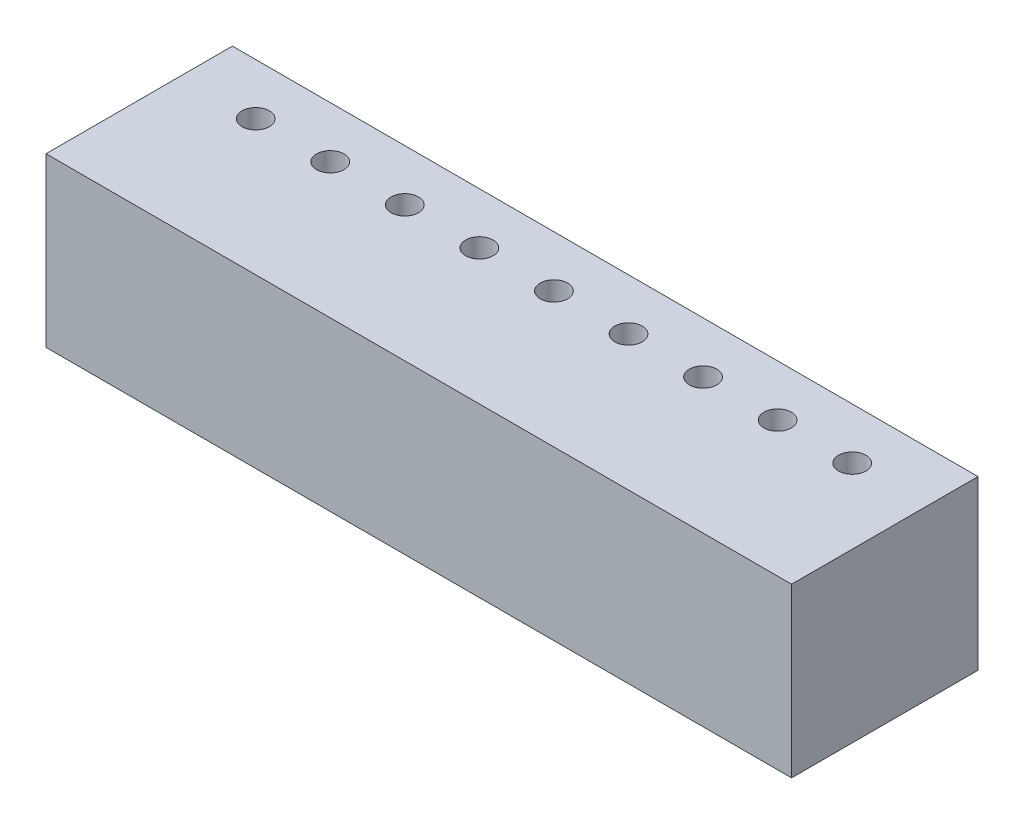
ISO-10303-21;
HEADER;
FILE_DESCRIPTION(('STEP AP214'),'2;1');
FILE_NAME('part.step','',(''),(''),'','','');
FILE_SCHEMA(('AUTOMOTIVE_DESIGN { 1 0 10303 214 1 1 1 1 }'));
ENDSEC;
DATA;
#1=APPLICATION_CONTEXT('core data for automotive mechanical design processes');
#2=APPLICATION_PROTOCOL_DEFINITION('international standard','automotive_design',2000,#1);
#3=PRODUCT_CONTEXT('',#1,'mechanical');
#4=PRODUCT('Part','Part','',(#3));
#5=PRODUCT_RELATED_PRODUCT_CATEGORY('part','',(#4));
#6=PRODUCT_DEFINITION_FORMATION('','',#4);
#7=PRODUCT_DEFINITION_CONTEXT('part definition',#1,'design');
#8=PRODUCT_DEFINITION('design','',#6,#7);
#9=PRODUCT_DEFINITION_SHAPE('','',#8);
#10=(LENGTH_UNIT() NAMED_UNIT(*) SI_UNIT(.MILLI.,.METRE.));
#11=(NAMED_UNIT(*) PLANE_ANGLE_UNIT() SI_UNIT($,.RADIAN.));
#12=(NAMED_UNIT(*) SI_UNIT($,.STERADIAN.) SOLID_ANGLE_UNIT());
#13=UNCERTAINTY_MEASURE_WITH_UNIT(LENGTH_MEASURE(1.E-05),#10,'distance_accuracy_value','');
#14=(GEOMETRIC_REPRESENTATION_CONTEXT(3) GLOBAL_UNCERTAINTY_ASSIGNED_CONTEXT((#13)) GLOBAL_UNIT_ASSIGNED_CONTEXT((#10,
#11,#12)) REPRESENTATION_CONTEXT('',''));
#15=CARTESIAN_POINT('',(0.,0.,0.));
#16=DIRECTION('',(0.,0.,1.));
#17=DIRECTION('',(1.,0.,0.));
#18=AXIS2_PLACEMENT_3D('',#15,#16,#17);
#19=CARTESIAN_POINT('',(0.,9.,0.));
#20=DIRECTION('',(0.,1.,0.));
#21=DIRECTION('',(0.,0.,1.));
#22=AXIS2_PLACEMENT_3D('',#19,#20,#21);
#23=PLANE('',#22);
#24=CARTESIAN_POINT('',(-3.54411764705882,9.,-11.441176470588));
#25=DIRECTION('',(0.,1.,0.));
#26=DIRECTION('',(0.,0.,1.));
#27=AXIS2_PLACEMENT_3D('',#24,#25,#26);
#28=CIRCLE('',#27,0.735294117647059);
#29=CARTESIAN_POINT('',(-3.54411764705882,9.,-10.705882352941));
#30=VERTEX_POINT('',#29);
#31=EDGE_CURVE('E151',#30,#30,#28,.T.);
#32=ORIENTED_EDGE('',*,*,#31,.F.);
#33=EDGE_LOOP('',(#32));
#34=FACE_BOUND('',#33,.T.);
#35=CARTESIAN_POINT('',(4.45588235294118,9.,-11.4411764705881));
#36=DIRECTION('',(0.,1.,0.));
#37=DIRECTION('',(0.,0.,1.));
#38=AXIS2_PLACEMENT_3D('',#35,#36,#37);
#39=CIRCLE('',#38,0.735294117647059);
#40=CARTESIAN_POINT('',(4.45588235294118,9.,-10.705882352941));
#41=VERTEX_POINT('',#40);
#42=EDGE_CURVE('E139',#41,#41,#39,.T.);
#43=ORIENTED_EDGE('',*,*,#42,.F.);
#44=EDGE_LOOP('',(#43));
#45=FACE_BOUND('',#44,.T.);
#46=CARTESIAN_POINT('',(12.4558823529412,9.,-11.4411764705882));
#47=DIRECTION('',(0.,1.,0.));
#48=DIRECTION('',(0.,0.,1.));
#49=AXIS2_PLACEMENT_3D('',#46,#47,#48);
#50=CIRCLE('',#49,0.735294117647059);
#51=CARTESIAN_POINT('',(12.4558823529412,9.,-10.7058823529411));
#52=VERTEX_POINT('',#51);
#53=EDGE_CURVE('E127',#52,#52,#50,.T.);
#54=ORIENTED_EDGE('',*,*,#53,.F.);
#55=EDGE_LOOP('',(#54));
#56=FACE_BOUND('',#55,.T.);
#57=CARTESIAN_POINT('',(20.4558823529412,9.,-11.4411764705882));
#58=DIRECTION('',(0.,1.,0.));
#59=DIRECTION('',(0.,0.,1.));
#60=AXIS2_PLACEMENT_3D('',#57,#58,#59);
#61=CIRCLE('',#60,0.735294117647059);
#62=CARTESIAN_POINT('',(20.4558823529412,9.,-10.7058823529412));
#63=VERTEX_POINT('',#62);
#64=EDGE_CURVE('E115',#63,#63,#61,.T.);
#65=ORIENTED_EDGE('',*,*,#64,.F.);
#66=EDGE_LOOP('',(#65));
#67=FACE_BOUND('',#66,.T.);
#68=DIRECTION('',(0.,0.,1.));
#69=VECTOR('',#68,1.);
#70=CARTESIAN_POINT('',(-11.5441176470588,9.,-14.1911764705882));
#71=LINE('',#70,#69);
#72=CARTESIAN_POINT('',(-11.5441176470588,9.,-14.1911764705882));
#73=VERTEX_POINT('',#72);
#74=CARTESIAN_POINT('',(-11.5441176470588,9.,-4.19117647058824));
#75=VERTEX_POINT('',#74);
#76=EDGE_CURVE('E85',#73,#75,#71,.T.);
#77=ORIENTED_EDGE('',*,*,#76,.T.);
#78=DIRECTION('',(1.,0.,0.));
#79=VECTOR('',#78,1.);
#80=CARTESIAN_POINT('',(-11.5441176470588,9.,-4.19117647058824));
#81=LINE('',#80,#79);
#82=CARTESIAN_POINT('',(28.4558823529412,9.,-4.19117647058824));
#83=VERTEX_POINT('',#82);
#84=EDGE_CURVE('E80',#75,#83,#81,.T.);
#85=ORIENTED_EDGE('',*,*,#84,.T.);
#86=DIRECTION('',(0.,0.,-1.));
#87=VECTOR('',#86,1.);
#88=CARTESIAN_POINT('',(28.4558823529412,9.,-14.1911764705882));
#89=LINE('',#88,#87);
#90=CARTESIAN_POINT('',(28.4558823529412,9.,-14.1911764705882));
#91=VERTEX_POINT('',#90);
#92=EDGE_CURVE('E83',#83,#91,#89,.T.);
#93=ORIENTED_EDGE('',*,*,#92,.T.);
#94=DIRECTION('',(-1.,0.,0.));
#95=VECTOR('',#94,1.);
#96=CARTESIAN_POINT('',(-11.5441176470588,9.,-14.1911764705882));
#97=LINE('',#96,#95);
#98=EDGE_CURVE('E50',#91,#73,#97,.T.);
#99=ORIENTED_EDGE('',*,*,#98,.T.);
#100=EDGE_LOOP('',(#77,#85,#93,#99));
#101=FACE_BOUND('',#100,.T.);
#102=CARTESIAN_POINT('',(24.4558823529412,9.,-11.4411764705882));
#103=DIRECTION('',(0.,1.,0.));
#104=DIRECTION('',(0.,0.,1.));
#105=AXIS2_PLACEMENT_3D('',#102,#103,#104);
#106=CIRCLE('',#105,0.735294117647059);
#107=CARTESIAN_POINT('',(24.4558823529412,9.,-10.7058823529412));
#108=VERTEX_POINT('',#107);
#109=EDGE_CURVE('E100',#108,#108,#106,.T.);
#110=ORIENTED_EDGE('',*,*,#109,.F.);
#111=EDGE_LOOP('',(#110));
#112=FACE_BOUND('',#111,.T.);
#113=CARTESIAN_POINT('',(16.4558823529412,9.,-11.4411764705882));
#114=DIRECTION('',(0.,1.,0.));
#115=DIRECTION('',(0.,0.,1.));
#116=AXIS2_PLACEMENT_3D('',#113,#114,#115);
#117=CIRCLE('',#116,0.735294117647059);
#118=CARTESIAN_POINT('',(16.4558823529412,9.,-10.7058823529411));
#119=VERTEX_POINT('',#118);
#120=EDGE_CURVE('E121',#119,#119,#117,.T.);
#121=ORIENTED_EDGE('',*,*,#120,.F.);
#122=EDGE_LOOP('',(#121));
#123=FACE_BOUND('',#122,.T.);
#124=CARTESIAN_POINT('',(8.45588235294118,9.,-11.4411764705881));
#125=DIRECTION('',(0.,1.,0.));
#126=DIRECTION('',(0.,0.,1.));
#127=AXIS2_PLACEMENT_3D('',#124,#125,#126);
#128=CIRCLE('',#127,0.735294117647059);
#129=CARTESIAN_POINT('',(8.45588235294118,9.,-10.7058823529411));
#130=VERTEX_POINT('',#129);
#131=EDGE_CURVE('E133',#130,#130,#128,.T.);
#132=ORIENTED_EDGE('',*,*,#131,.F.);
#133=EDGE_LOOP('',(#132));
#134=FACE_BOUND('',#133,.T.);
#135=CARTESIAN_POINT('',(0.455882352941178,9.,-11.4411764705881));
#136=DIRECTION('',(0.,1.,0.));
#137=DIRECTION('',(0.,0.,1.));
#138=AXIS2_PLACEMENT_3D('',#135,#136,#137);
#139=CIRCLE('',#138,0.735294117647059);
#140=CARTESIAN_POINT('',(0.455882352941178,9.,-10.705882352941));
#141=VERTEX_POINT('',#140);
#142=EDGE_CURVE('E145',#141,#141,#139,.T.);
#143=ORIENTED_EDGE('',*,*,#142,.F.);
#144=EDGE_LOOP('',(#143));
#145=FACE_BOUND('',#144,.T.);
#146=CARTESIAN_POINT('',(-7.54411764705882,9.,-11.441176470588));
#147=DIRECTION('',(0.,1.,0.));
#148=DIRECTION('',(0.,0.,1.));
#149=AXIS2_PLACEMENT_3D('',#146,#147,#148);
#150=CIRCLE('',#149,0.735294117647059);
#151=CARTESIAN_POINT('',(-7.54411764705882,9.,-10.705882352941));
#152=VERTEX_POINT('',#151);
#153=EDGE_CURVE('E157',#152,#152,#150,.T.);
#154=ORIENTED_EDGE('',*,*,#153,.F.);
#155=EDGE_LOOP('',(#154));
#156=FACE_BOUND('',#155,.T.);
#157=ADVANCED_FACE('F33',(#34,#45,#56,#67,#101,#112,#123,#134,#145,#156),#23,.T.);
#158=CARTESIAN_POINT('',(0.,0.,0.));
#159=DIRECTION('',(0.,1.,0.));
#160=DIRECTION('',(0.,0.,1.));
#161=AXIS2_PLACEMENT_3D('',#158,#159,#160);
#162=PLANE('',#161);
#163=DIRECTION('',(0.,0.,1.));
#164=VECTOR('',#163,1.);
#165=CARTESIAN_POINT('',(-11.5441176470588,0.,-14.1911764705882));
#166=LINE('',#165,#164);
#167=CARTESIAN_POINT('',(-11.5441176470588,0.,-14.1911764705882));
#168=VERTEX_POINT('',#167);
#169=CARTESIAN_POINT('',(-11.5441176470588,0.,-4.19117647058824));
#170=VERTEX_POINT('',#169);
#171=EDGE_CURVE('E97',#168,#170,#166,.T.);
#172=ORIENTED_EDGE('',*,*,#171,.F.);
#173=DIRECTION('',(-1.,0.,0.));
#174=VECTOR('',#173,1.);
#175=CARTESIAN_POINT('',(-11.5441176470588,0.,-14.1911764705882));
#176=LINE('',#175,#174);
#177=CARTESIAN_POINT('',(28.4558823529412,0.,-14.1911764705882));
#178=VERTEX_POINT('',#177);
#179=EDGE_CURVE('E73',#178,#168,#176,.T.);
#180=ORIENTED_EDGE('',*,*,#179,.F.);
#181=DIRECTION('',(0.,0.,-1.));
#182=VECTOR('',#181,1.);
#183=CARTESIAN_POINT('',(28.4558823529412,0.,-14.1911764705882));
#184=LINE('',#183,#182);
#185=CARTESIAN_POINT('',(28.4558823529412,0.,-4.19117647058824));
#186=VERTEX_POINT('',#185);
#187=EDGE_CURVE('E67',#186,#178,#184,.T.);
#188=ORIENTED_EDGE('',*,*,#187,.F.);
#189=DIRECTION('',(1.,0.,0.));
#190=VECTOR('',#189,1.);
#191=CARTESIAN_POINT('',(-11.5441176470588,0.,-4.19117647058824));
#192=LINE('',#191,#190);
#193=EDGE_CURVE('E89',#170,#186,#192,.T.);
#194=ORIENTED_EDGE('',*,*,#193,.F.);
#195=EDGE_LOOP('',(#172,#180,#188,#194));
#196=FACE_BOUND('',#195,.T.);
#197=CARTESIAN_POINT('',(24.4558823529412,0.,-11.4411764705882));
#198=DIRECTION('',(0.,1.,0.));
#199=DIRECTION('',(0.,0.,1.));
#200=AXIS2_PLACEMENT_3D('',#197,#198,#199);
#201=CIRCLE('',#200,0.735294117647059);
#202=CARTESIAN_POINT('',(24.4558823529412,0.,-10.7058823529412));
#203=VERTEX_POINT('',#202);
#204=EDGE_CURVE('E112',#203,#203,#201,.T.);
#205=ORIENTED_EDGE('',*,*,#204,.T.);
#206=EDGE_LOOP('',(#205));
#207=FACE_BOUND('',#206,.T.);
#208=CARTESIAN_POINT('',(20.4558823529412,0.,-11.4411764705882));
#209=DIRECTION('',(0.,1.,0.));
#210=DIRECTION('',(0.,0.,1.));
#211=AXIS2_PLACEMENT_3D('',#208,#209,#210);
#212=CIRCLE('',#211,0.735294117647059);
#213=CARTESIAN_POINT('',(20.4558823529412,0.,-10.7058823529412));
#214=VERTEX_POINT('',#213);
#215=EDGE_CURVE('E118',#214,#214,#212,.T.);
#216=ORIENTED_EDGE('',*,*,#215,.T.);
#217=EDGE_LOOP('',(#216));
#218=FACE_BOUND('',#217,.T.);
#219=CARTESIAN_POINT('',(16.4558823529412,0.,-11.4411764705882));
#220=DIRECTION('',(0.,1.,0.));
#221=DIRECTION('',(0.,0.,1.));
#222=AXIS2_PLACEMENT_3D('',#219,#220,#221);
#223=CIRCLE('',#222,0.735294117647059);
#224=CARTESIAN_POINT('',(16.4558823529412,0.,-10.7058823529411));
#225=VERTEX_POINT('',#224);
#226=EDGE_CURVE('E124',#225,#225,#223,.T.);
#227=ORIENTED_EDGE('',*,*,#226,.T.);
#228=EDGE_LOOP('',(#227));
#229=FACE_BOUND('',#228,.T.);
#230=CARTESIAN_POINT('',(12.4558823529412,0.,-11.4411764705882));
#231=DIRECTION('',(0.,1.,0.));
#232=DIRECTION('',(0.,0.,1.));
#233=AXIS2_PLACEMENT_3D('',#230,#231,#232);
#234=CIRCLE('',#233,0.735294117647059);
#235=CARTESIAN_POINT('',(12.4558823529412,0.,-10.7058823529411));
#236=VERTEX_POINT('',#235);
#237=EDGE_CURVE('E130',#236,#236,#234,.T.);
#238=ORIENTED_EDGE('',*,*,#237,.T.);
#239=EDGE_LOOP('',(#238));
#240=FACE_BOUND('',#239,.T.);
#241=CARTESIAN_POINT('',(8.45588235294118,0.,-11.4411764705881));
#242=DIRECTION('',(0.,1.,0.));
#243=DIRECTION('',(0.,0.,1.));
#244=AXIS2_PLACEMENT_3D('',#241,#242,#243);
#245=CIRCLE('',#244,0.735294117647059);
#246=CARTESIAN_POINT('',(8.45588235294118,0.,-10.7058823529411));
#247=VERTEX_POINT('',#246);
#248=EDGE_CURVE('E136',#247,#247,#245,.T.);
#249=ORIENTED_EDGE('',*,*,#248,.T.);
#250=EDGE_LOOP('',(#249));
#251=FACE_BOUND('',#250,.T.);
#252=CARTESIAN_POINT('',(4.45588235294118,0.,-11.4411764705881));
#253=DIRECTION('',(0.,1.,0.));
#254=DIRECTION('',(0.,0.,1.));
#255=AXIS2_PLACEMENT_3D('',#252,#253,#254);
#256=CIRCLE('',#255,0.735294117647059);
#257=CARTESIAN_POINT('',(4.45588235294118,0.,-10.705882352941));
#258=VERTEX_POINT('',#257);
#259=EDGE_CURVE('E142',#258,#258,#256,.T.);
#260=ORIENTED_EDGE('',*,*,#259,.T.);
#261=EDGE_LOOP('',(#260));
#262=FACE_BOUND('',#261,.T.);
#263=CARTESIAN_POINT('',(0.455882352941178,0.,-11.4411764705881));
#264=DIRECTION('',(0.,1.,0.));
#265=DIRECTION('',(0.,0.,1.));
#266=AXIS2_PLACEMENT_3D('',#263,#264,#265);
#267=CIRCLE('',#266,0.735294117647059);
#268=CARTESIAN_POINT('',(0.455882352941178,0.,-10.705882352941));
#269=VERTEX_POINT('',#268);
#270=EDGE_CURVE('E148',#269,#269,#267,.T.);
#271=ORIENTED_EDGE('',*,*,#270,.T.);
#272=EDGE_LOOP('',(#271));
#273=FACE_BOUND('',#272,.T.);
#274=CARTESIAN_POINT('',(-3.54411764705882,0.,-11.441176470588));
#275=DIRECTION('',(0.,1.,0.));
#276=DIRECTION('',(0.,0.,1.));
#277=AXIS2_PLACEMENT_3D('',#274,#275,#276);
#278=CIRCLE('',#277,0.735294117647059);
#279=CARTESIAN_POINT('',(-3.54411764705882,0.,-10.705882352941));
#280=VERTEX_POINT('',#279);
#281=EDGE_CURVE('E154',#280,#280,#278,.T.);
#282=ORIENTED_EDGE('',*,*,#281,.T.);
#283=EDGE_LOOP('',(#282));
#284=FACE_BOUND('',#283,.T.);
#285=CARTESIAN_POINT('',(-7.54411764705882,0.,-11.441176470588));
#286=DIRECTION('',(0.,1.,0.));
#287=DIRECTION('',(0.,0.,1.));
#288=AXIS2_PLACEMENT_3D('',#285,#286,#287);
#289=CIRCLE('',#288,0.735294117647059);
#290=CARTESIAN_POINT('',(-7.54411764705882,0.,-10.705882352941));
#291=VERTEX_POINT('',#290);
#292=EDGE_CURVE('E160',#291,#291,#289,.T.);
#293=ORIENTED_EDGE('',*,*,#292,.T.);
#294=EDGE_LOOP('',(#293));
#295=FACE_BOUND('',#294,.T.);
#296=ADVANCED_FACE('F108',(#196,#207,#218,#229,#240,#251,#262,#273,#284,#295),#162,.F.);
#297=CARTESIAN_POINT('',(-11.5441176470588,9.,-14.1911764705882));
#298=DIRECTION('',(1.,0.,0.));
#299=DIRECTION('',(0.,0.,-1.));
#300=AXIS2_PLACEMENT_3D('',#297,#298,#299);
#301=PLANE('',#300);
#302=ORIENTED_EDGE('',*,*,#171,.T.);
#303=DIRECTION('',(0.,-1.,0.));
#304=VECTOR('',#303,1.);
#305=CARTESIAN_POINT('',(-11.5441176470588,9.,-4.19117647058824));
#306=LINE('',#305,#304);
#307=EDGE_CURVE('E11',#75,#170,#306,.T.);
#308=ORIENTED_EDGE('',*,*,#307,.F.);
#309=ORIENTED_EDGE('',*,*,#76,.F.);
#310=DIRECTION('',(0.,-1.,0.));
#311=VECTOR('',#310,1.);
#312=CARTESIAN_POINT('',(-11.5441176470588,9.,-14.1911764705882));
#313=LINE('',#312,#311);
#314=EDGE_CURVE('E93',#73,#168,#313,.T.);
#315=ORIENTED_EDGE('',*,*,#314,.T.);
#316=EDGE_LOOP('',(#302,#308,#309,#315));
#317=FACE_BOUND('',#316,.T.);
#318=ADVANCED_FACE('F35',(#317),#301,.F.);
#319=CARTESIAN_POINT('',(-11.5441176470588,9.,-4.19117647058824));
#320=DIRECTION('',(0.,0.,-1.));
#321=DIRECTION('',(-1.,0.,0.));
#322=AXIS2_PLACEMENT_3D('',#319,#320,#321);
#323=PLANE('',#322);
#324=ORIENTED_EDGE('',*,*,#193,.T.);
#325=DIRECTION('',(0.,-1.,0.));
#326=VECTOR('',#325,1.);
#327=CARTESIAN_POINT('',(28.4558823529412,9.,-4.19117647058824));
#328=LINE('',#327,#326);
#329=EDGE_CURVE('E42',#83,#186,#328,.T.);
#330=ORIENTED_EDGE('',*,*,#329,.F.);
#331=ORIENTED_EDGE('',*,*,#84,.F.);
#332=ORIENTED_EDGE('',*,*,#307,.T.);
#333=EDGE_LOOP('',(#324,#330,#331,#332));
#334=FACE_BOUND('',#333,.T.);
#335=ADVANCED_FACE('F88',(#334),#323,.F.);
#336=CARTESIAN_POINT('',(28.4558823529412,9.,-14.1911764705882));
#337=DIRECTION('',(-1.,0.,0.));
#338=DIRECTION('',(0.,0.,1.));
#339=AXIS2_PLACEMENT_3D('',#336,#337,#338);
#340=PLANE('',#339);
#341=ORIENTED_EDGE('',*,*,#187,.T.);
#342=DIRECTION('',(0.,-1.,0.));
#343=VECTOR('',#342,1.);
#344=CARTESIAN_POINT('',(28.4558823529412,9.,-14.1911764705882));
#345=LINE('',#344,#343);
#346=EDGE_CURVE('E90',#91,#178,#345,.T.);
#347=ORIENTED_EDGE('',*,*,#346,.F.);
#348=ORIENTED_EDGE('',*,*,#92,.F.);
#349=ORIENTED_EDGE('',*,*,#329,.T.);
#350=EDGE_LOOP('',(#341,#347,#348,#349));
#351=FACE_BOUND('',#350,.T.);
#352=ADVANCED_FACE('F91',(#351),#340,.F.);
#353=CARTESIAN_POINT('',(-11.5441176470588,9.,-14.1911764705882));
#354=DIRECTION('',(0.,0.,1.));
#355=DIRECTION('',(1.,0.,0.));
#356=AXIS2_PLACEMENT_3D('',#353,#354,#355);
#357=PLANE('',#356);
#358=ORIENTED_EDGE('',*,*,#179,.T.);
#359=ORIENTED_EDGE('',*,*,#314,.F.);
#360=ORIENTED_EDGE('',*,*,#98,.F.);
#361=ORIENTED_EDGE('',*,*,#346,.T.);
#362=EDGE_LOOP('',(#358,#359,#360,#361));
#363=FACE_BOUND('',#362,.T.);
#364=ADVANCED_FACE('F105',(#363),#357,.F.);
#365=CARTESIAN_POINT('',(24.4558823529412,9.,-11.4411764705882));
#366=DIRECTION('',(0.,-1.,0.));
#367=DIRECTION('',(0.,0.,-1.));
#368=AXIS2_PLACEMENT_3D('',#365,#366,#367);
#369=CYLINDRICAL_SURFACE('',#368,0.735294117647059);
#370=ORIENTED_EDGE('',*,*,#109,.T.);
#371=EDGE_LOOP('',(#370));
#372=FACE_BOUND('',#371,.T.);
#373=ORIENTED_EDGE('',*,*,#204,.F.);
#374=EDGE_LOOP('',(#373));
#375=FACE_BOUND('',#374,.T.);
#376=ADVANCED_FACE('F179',(#372,#375),#369,.F.);
#377=CARTESIAN_POINT('',(20.4558823529412,9.,-11.4411764705882));
#378=DIRECTION('',(0.,-1.,0.));
#379=DIRECTION('',(0.,0.,-1.));
#380=AXIS2_PLACEMENT_3D('',#377,#378,#379);
#381=CYLINDRICAL_SURFACE('',#380,0.735294117647059);
#382=ORIENTED_EDGE('',*,*,#64,.T.);
#383=EDGE_LOOP('',(#382));
#384=FACE_BOUND('',#383,.T.);
#385=ORIENTED_EDGE('',*,*,#215,.F.);
#386=EDGE_LOOP('',(#385));
#387=FACE_BOUND('',#386,.T.);
#388=ADVANCED_FACE('F225',(#384,#387),#381,.F.);
#389=CARTESIAN_POINT('',(16.4558823529412,9.,-11.4411764705882));
#390=DIRECTION('',(0.,-1.,0.));
#391=DIRECTION('',(0.,0.,-1.));
#392=AXIS2_PLACEMENT_3D('',#389,#390,#391);
#393=CYLINDRICAL_SURFACE('',#392,0.735294117647059);
#394=ORIENTED_EDGE('',*,*,#120,.T.);
#395=EDGE_LOOP('',(#394));
#396=FACE_BOUND('',#395,.T.);
#397=ORIENTED_EDGE('',*,*,#226,.F.);
#398=EDGE_LOOP('',(#397));
#399=FACE_BOUND('',#398,.T.);
#400=ADVANCED_FACE('F233',(#396,#399),#393,.F.);
#401=CARTESIAN_POINT('',(12.4558823529412,9.,-11.4411764705882));
#402=DIRECTION('',(0.,-1.,0.));
#403=DIRECTION('',(0.,0.,-1.));
#404=AXIS2_PLACEMENT_3D('',#401,#402,#403);
#405=CYLINDRICAL_SURFACE('',#404,0.735294117647059);
#406=ORIENTED_EDGE('',*,*,#53,.T.);
#407=EDGE_LOOP('',(#406));
#408=FACE_BOUND('',#407,.T.);
#409=ORIENTED_EDGE('',*,*,#237,.F.);
#410=EDGE_LOOP('',(#409));
#411=FACE_BOUND('',#410,.T.);
#412=ADVANCED_FACE('F241',(#408,#411),#405,.F.);
#413=CARTESIAN_POINT('',(8.45588235294118,9.,-11.4411764705881));
#414=DIRECTION('',(0.,-1.,0.));
#415=DIRECTION('',(0.,0.,-1.));
#416=AXIS2_PLACEMENT_3D('',#413,#414,#415);
#417=CYLINDRICAL_SURFACE('',#416,0.735294117647059);
#418=ORIENTED_EDGE('',*,*,#131,.T.);
#419=EDGE_LOOP('',(#418));
#420=FACE_BOUND('',#419,.T.);
#421=ORIENTED_EDGE('',*,*,#248,.F.);
#422=EDGE_LOOP('',(#421));
#423=FACE_BOUND('',#422,.T.);
#424=ADVANCED_FACE('F250',(#420,#423),#417,.F.);
#425=CARTESIAN_POINT('',(4.45588235294118,9.,-11.4411764705881));
#426=DIRECTION('',(0.,-1.,0.));
#427=DIRECTION('',(0.,0.,-1.));
#428=AXIS2_PLACEMENT_3D('',#425,#426,#427);
#429=CYLINDRICAL_SURFACE('',#428,0.735294117647059);
#430=ORIENTED_EDGE('',*,*,#42,.T.);
#431=EDGE_LOOP('',(#430));
#432=FACE_BOUND('',#431,.T.);
#433=ORIENTED_EDGE('',*,*,#259,.F.);
#434=EDGE_LOOP('',(#433));
#435=FACE_BOUND('',#434,.T.);
#436=ADVANCED_FACE('F259',(#432,#435),#429,.F.);
#437=CARTESIAN_POINT('',(0.455882352941178,9.,-11.4411764705881));
#438=DIRECTION('',(0.,-1.,0.));
#439=DIRECTION('',(0.,0.,-1.));
#440=AXIS2_PLACEMENT_3D('',#437,#438,#439);
#441=CYLINDRICAL_SURFACE('',#440,0.735294117647059);
#442=ORIENTED_EDGE('',*,*,#142,.T.);
#443=EDGE_LOOP('',(#442));
#444=FACE_BOUND('',#443,.T.);
#445=ORIENTED_EDGE('',*,*,#270,.F.);
#446=EDGE_LOOP('',(#445));
#447=FACE_BOUND('',#446,.T.);
#448=ADVANCED_FACE('F268',(#444,#447),#441,.F.);
#449=CARTESIAN_POINT('',(-3.54411764705882,9.,-11.441176470588));
#450=DIRECTION('',(0.,-1.,0.));
#451=DIRECTION('',(0.,0.,-1.));
#452=AXIS2_PLACEMENT_3D('',#449,#450,#451);
#453=CYLINDRICAL_SURFACE('',#452,0.735294117647059);
#454=ORIENTED_EDGE('',*,*,#31,.T.);
#455=EDGE_LOOP('',(#454));
#456=FACE_BOUND('',#455,.T.);
#457=ORIENTED_EDGE('',*,*,#281,.F.);
#458=EDGE_LOOP('',(#457));
#459=FACE_BOUND('',#458,.T.);
#460=ADVANCED_FACE('F277',(#456,#459),#453,.F.);
#461=CARTESIAN_POINT('',(-7.54411764705882,9.,-11.441176470588));
#462=DIRECTION('',(0.,-1.,0.));
#463=DIRECTION('',(0.,0.,-1.));
#464=AXIS2_PLACEMENT_3D('',#461,#462,#463);
#465=CYLINDRICAL_SURFACE('',#464,0.735294117647059);
#466=ORIENTED_EDGE('',*,*,#153,.T.);
#467=EDGE_LOOP('',(#466));
#468=FACE_BOUND('',#467,.T.);
#469=ORIENTED_EDGE('',*,*,#292,.F.);
#470=EDGE_LOOP('',(#469));
#471=FACE_BOUND('',#470,.T.);
#472=ADVANCED_FACE('F166',(#468,#471),#465,.F.);
#473=CLOSED_SHELL('',(#157,#296,#318,#335,#352,#364,#376,#388,#400,#412,#424,#436,#448,#460,#472));
#474=MANIFOLD_SOLID_BREP('B2',#473);
#475=ADVANCED_BREP_SHAPE_REPRESENTATION('',(#18,#474),#14);
#476=SHAPE_DEFINITION_REPRESENTATION(#9,#475);
ENDSEC;
END-ISO-10303-21;
